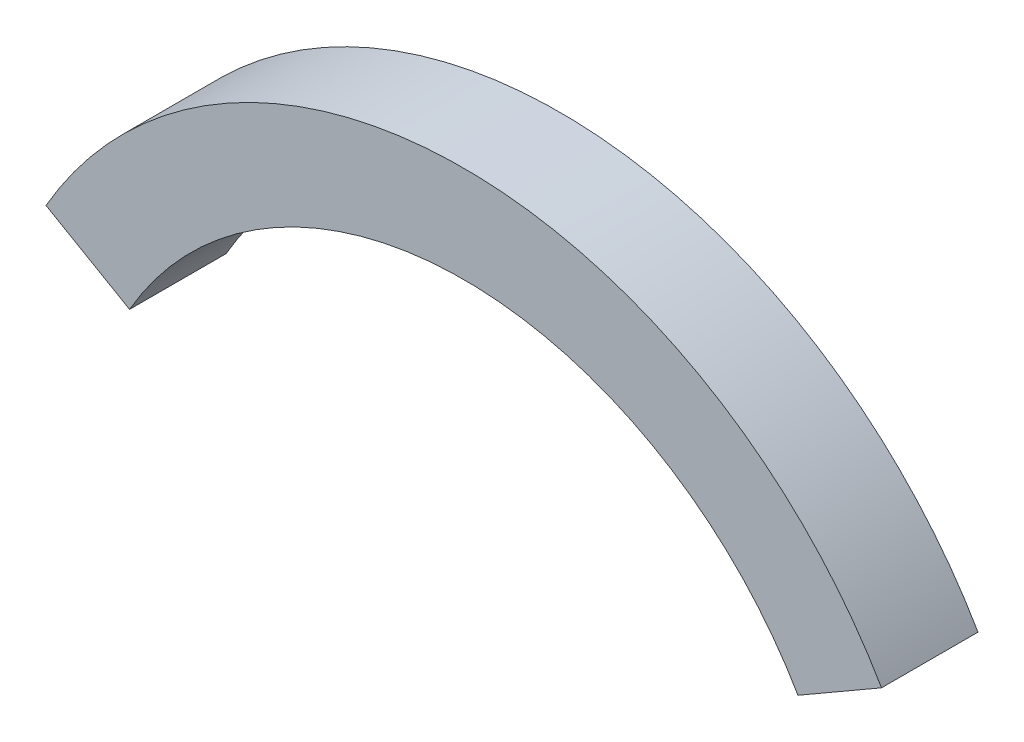
ISO-10303-21;
HEADER;
FILE_DESCRIPTION(('STEP AP214'),'2;1');
FILE_NAME('part.step','',(''),(''),'','','');
FILE_SCHEMA(('AUTOMOTIVE_DESIGN { 1 0 10303 214 1 1 1 1 }'));
ENDSEC;
DATA;
#1=APPLICATION_CONTEXT('core data for automotive mechanical design processes');
#2=APPLICATION_PROTOCOL_DEFINITION('international standard','automotive_design',2000,#1);
#3=PRODUCT_CONTEXT('',#1,'mechanical');
#4=PRODUCT('Part','Part','',(#3));
#5=PRODUCT_RELATED_PRODUCT_CATEGORY('part','',(#4));
#6=PRODUCT_DEFINITION_FORMATION('','',#4);
#7=PRODUCT_DEFINITION_CONTEXT('part definition',#1,'design');
#8=PRODUCT_DEFINITION('design','',#6,#7);
#9=PRODUCT_DEFINITION_SHAPE('','',#8);
#10=(LENGTH_UNIT() NAMED_UNIT(*) SI_UNIT(.MILLI.,.METRE.));
#11=(NAMED_UNIT(*) PLANE_ANGLE_UNIT() SI_UNIT($,.RADIAN.));
#12=(NAMED_UNIT(*) SI_UNIT($,.STERADIAN.) SOLID_ANGLE_UNIT());
#13=UNCERTAINTY_MEASURE_WITH_UNIT(LENGTH_MEASURE(1.E-05),#10,'distance_accuracy_value','');
#14=(GEOMETRIC_REPRESENTATION_CONTEXT(3) GLOBAL_UNCERTAINTY_ASSIGNED_CONTEXT((#13)) GLOBAL_UNIT_ASSIGNED_CONTEXT((#10,
#11,#12)) REPRESENTATION_CONTEXT('',''));
#15=CARTESIAN_POINT('',(0.,0.,0.));
#16=DIRECTION('',(0.,0.,1.));
#17=DIRECTION('',(1.,0.,0.));
#18=AXIS2_PLACEMENT_3D('',#15,#16,#17);
#19=CARTESIAN_POINT('',(86.6025403784438,-50.0000000000001,20.));
#20=DIRECTION('',(0.,0.,-1.));
#21=DIRECTION('',(-1.,0.,0.));
#22=AXIS2_PLACEMENT_3D('',#19,#20,#21);
#23=CYLINDRICAL_SURFACE('',#22,100.);
#24=CARTESIAN_POINT('',(86.6025403784438,-50.0000000000001,0.));
#25=DIRECTION('',(0.,0.,1.));
#26=DIRECTION('',(-1.,0.,0.));
#27=AXIS2_PLACEMENT_3D('',#24,#25,#26);
#28=CIRCLE('',#27,100.);
#29=CARTESIAN_POINT('',(173.205080756888,0.,0.));
#30=VERTEX_POINT('',#29);
#31=CARTESIAN_POINT('',(0.,0.,0.));
#32=VERTEX_POINT('',#31);
#33=EDGE_CURVE('E100',#30,#32,#28,.T.);
#34=ORIENTED_EDGE('',*,*,#33,.T.);
#35=DIRECTION('',(0.,0.,-1.));
#36=VECTOR('',#35,1.);
#37=CARTESIAN_POINT('',(0.,0.,20.));
#38=LINE('',#37,#36);
#39=CARTESIAN_POINT('',(0.,0.,20.));
#40=VERTEX_POINT('',#39);
#41=EDGE_CURVE('E11',#40,#32,#38,.T.);
#42=ORIENTED_EDGE('',*,*,#41,.F.);
#43=CARTESIAN_POINT('',(86.6025403784438,-50.0000000000001,20.));
#44=DIRECTION('',(0.,0.,1.));
#45=DIRECTION('',(-1.,0.,0.));
#46=AXIS2_PLACEMENT_3D('',#43,#44,#45);
#47=CIRCLE('',#46,100.);
#48=CARTESIAN_POINT('',(173.205080756888,0.,20.));
#49=VERTEX_POINT('',#48);
#50=EDGE_CURVE('E88',#49,#40,#47,.T.);
#51=ORIENTED_EDGE('',*,*,#50,.F.);
#52=DIRECTION('',(0.,0.,-1.));
#53=VECTOR('',#52,1.);
#54=CARTESIAN_POINT('',(173.205080756888,0.,20.));
#55=LINE('',#54,#53);
#56=EDGE_CURVE('E96',#49,#30,#55,.T.);
#57=ORIENTED_EDGE('',*,*,#56,.T.);
#58=EDGE_LOOP('',(#34,#42,#51,#57));
#59=FACE_BOUND('',#58,.T.);
#60=ADVANCED_FACE('F37',(#59),#23,.T.);
#61=CARTESIAN_POINT('',(0.,0.,20.));
#62=DIRECTION('',(0.500000000000002,0.866025403784438,0.));
#63=DIRECTION('',(-0.866025403784438,0.500000000000002,0.));
#64=AXIS2_PLACEMENT_3D('',#61,#62,#63);
#65=PLANE('',#64);
#66=DIRECTION('',(0.866025403784438,-0.500000000000002,0.));
#67=VECTOR('',#66,1.);
#68=CARTESIAN_POINT('',(0.,0.,0.));
#69=LINE('',#68,#67);
#70=CARTESIAN_POINT('',(17.3205080756887,-10.,0.));
#71=VERTEX_POINT('',#70);
#72=EDGE_CURVE('E92',#32,#71,#69,.T.);
#73=ORIENTED_EDGE('',*,*,#72,.T.);
#74=DIRECTION('',(0.,0.,-1.));
#75=VECTOR('',#74,1.);
#76=CARTESIAN_POINT('',(17.3205080756887,-10.,20.));
#77=LINE('',#76,#75);
#78=CARTESIAN_POINT('',(17.3205080756887,-10.,20.));
#79=VERTEX_POINT('',#78);
#80=EDGE_CURVE('E45',#79,#71,#77,.T.);
#81=ORIENTED_EDGE('',*,*,#80,.F.);
#82=DIRECTION('',(0.866025403784438,-0.500000000000002,0.));
#83=VECTOR('',#82,1.);
#84=CARTESIAN_POINT('',(0.,0.,20.));
#85=LINE('',#84,#83);
#86=EDGE_CURVE('E83',#40,#79,#85,.T.);
#87=ORIENTED_EDGE('',*,*,#86,.F.);
#88=ORIENTED_EDGE('',*,*,#41,.T.);
#89=EDGE_LOOP('',(#73,#81,#87,#88));
#90=FACE_BOUND('',#89,.T.);
#91=ADVANCED_FACE('F91',(#90),#65,.F.);
#92=CARTESIAN_POINT('',(86.6025403784438,-50.0000000000001,20.));
#93=DIRECTION('',(0.,0.,-1.));
#94=DIRECTION('',(-1.,0.,0.));
#95=AXIS2_PLACEMENT_3D('',#92,#93,#94);
#96=CYLINDRICAL_SURFACE('',#95,80.);
#97=CARTESIAN_POINT('',(86.6025403784438,-50.0000000000001,0.));
#98=DIRECTION('',(0.,0.,-1.));
#99=DIRECTION('',(-1.,0.,0.));
#100=AXIS2_PLACEMENT_3D('',#97,#98,#99);
#101=CIRCLE('',#100,80.);
#102=CARTESIAN_POINT('',(155.884572681199,-10.,0.));
#103=VERTEX_POINT('',#102);
#104=EDGE_CURVE('E70',#71,#103,#101,.T.);
#105=ORIENTED_EDGE('',*,*,#104,.T.);
#106=DIRECTION('',(0.,0.,-1.));
#107=VECTOR('',#106,1.);
#108=CARTESIAN_POINT('',(155.884572681199,-10.,20.));
#109=LINE('',#108,#107);
#110=CARTESIAN_POINT('',(155.884572681199,-10.,20.));
#111=VERTEX_POINT('',#110);
#112=EDGE_CURVE('E93',#111,#103,#109,.T.);
#113=ORIENTED_EDGE('',*,*,#112,.F.);
#114=CARTESIAN_POINT('',(86.6025403784438,-50.0000000000001,20.));
#115=DIRECTION('',(0.,0.,-1.));
#116=DIRECTION('',(-1.,0.,0.));
#117=AXIS2_PLACEMENT_3D('',#114,#115,#116);
#118=CIRCLE('',#117,80.);
#119=EDGE_CURVE('E86',#79,#111,#118,.T.);
#120=ORIENTED_EDGE('',*,*,#119,.F.);
#121=ORIENTED_EDGE('',*,*,#80,.T.);
#122=EDGE_LOOP('',(#105,#113,#120,#121));
#123=FACE_BOUND('',#122,.T.);
#124=ADVANCED_FACE('F94',(#123),#96,.F.);
#125=CARTESIAN_POINT('',(173.205080756888,0.,20.));
#126=DIRECTION('',(-0.500000000000002,0.866025403784438,0.));
#127=DIRECTION('',(-0.866025403784438,-0.500000000000002,0.));
#128=AXIS2_PLACEMENT_3D('',#125,#126,#127);
#129=PLANE('',#128);
#130=DIRECTION('',(0.866025403784438,0.500000000000002,0.));
#131=VECTOR('',#130,1.);
#132=CARTESIAN_POINT('',(173.205080756888,0.,0.));
#133=LINE('',#132,#131);
#134=EDGE_CURVE('E76',#103,#30,#133,.T.);
#135=ORIENTED_EDGE('',*,*,#134,.T.);
#136=ORIENTED_EDGE('',*,*,#56,.F.);
#137=DIRECTION('',(0.866025403784438,0.500000000000002,0.));
#138=VECTOR('',#137,1.);
#139=CARTESIAN_POINT('',(173.205080756888,0.,20.));
#140=LINE('',#139,#138);
#141=EDGE_CURVE('E53',#111,#49,#140,.T.);
#142=ORIENTED_EDGE('',*,*,#141,.F.);
#143=ORIENTED_EDGE('',*,*,#112,.T.);
#144=EDGE_LOOP('',(#135,#136,#142,#143));
#145=FACE_BOUND('',#144,.T.);
#146=ADVANCED_FACE('F107',(#145),#129,.F.);
#147=CARTESIAN_POINT('',(86.6025403784438,-50.0000000000001,20.));
#148=DIRECTION('',(0.,0.,-1.));
#149=DIRECTION('',(-1.,0.,0.));
#150=AXIS2_PLACEMENT_3D('',#147,#148,#149);
#151=PLANE('',#150);
#152=ORIENTED_EDGE('',*,*,#50,.T.);
#153=ORIENTED_EDGE('',*,*,#86,.T.);
#154=ORIENTED_EDGE('',*,*,#119,.T.);
#155=ORIENTED_EDGE('',*,*,#141,.T.);
#156=EDGE_LOOP('',(#152,#153,#154,#155));
#157=FACE_BOUND('',#156,.T.);
#158=ADVANCED_FACE('F84',(#157),#151,.F.);
#159=CARTESIAN_POINT('',(86.6025403784438,-50.0000000000001,0.));
#160=DIRECTION('',(0.,0.,-1.));
#161=DIRECTION('',(-1.,0.,0.));
#162=AXIS2_PLACEMENT_3D('',#159,#160,#161);
#163=PLANE('',#162);
#164=ORIENTED_EDGE('',*,*,#33,.F.);
#165=ORIENTED_EDGE('',*,*,#134,.F.);
#166=ORIENTED_EDGE('',*,*,#104,.F.);
#167=ORIENTED_EDGE('',*,*,#72,.F.);
#168=EDGE_LOOP('',(#164,#165,#166,#167));
#169=FACE_BOUND('',#168,.T.);
#170=ADVANCED_FACE('F110',(#169),#163,.T.);
#171=CLOSED_SHELL('',(#60,#91,#124,#146,#158,#170));
#172=MANIFOLD_SOLID_BREP('B2',#171);
#173=ADVANCED_BREP_SHAPE_REPRESENTATION('',(#18,#172),#14);
#174=SHAPE_DEFINITION_REPRESENTATION(#9,#173);
ENDSEC;
END-ISO-10303-21;
